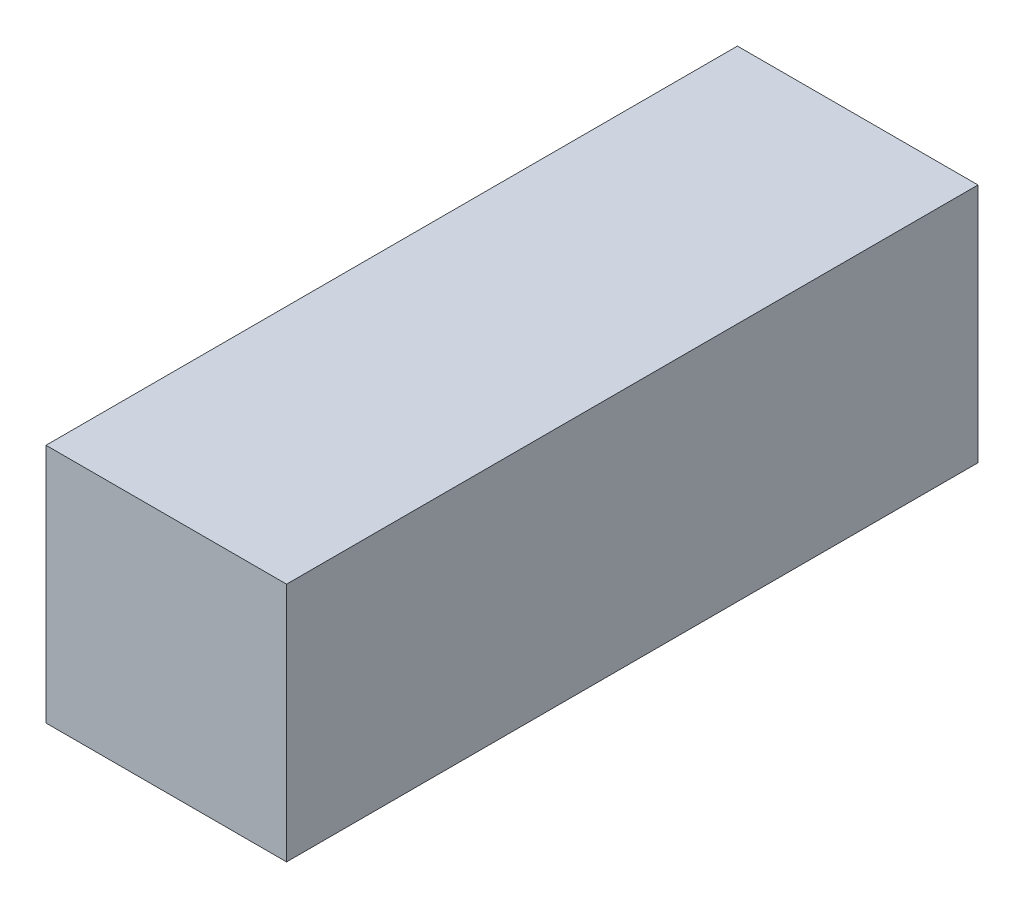
ISO-10303-21;
HEADER;
FILE_DESCRIPTION(('STEP AP214'),'2;1');
FILE_NAME('part.step','',(''),(''),'','','');
FILE_SCHEMA(('AUTOMOTIVE_DESIGN { 1 0 10303 214 1 1 1 1 }'));
ENDSEC;
DATA;
#1=APPLICATION_CONTEXT('core data for automotive mechanical design processes');
#2=APPLICATION_PROTOCOL_DEFINITION('international standard','automotive_design',2000,#1);
#3=PRODUCT_CONTEXT('',#1,'mechanical');
#4=PRODUCT('Part','Part','',(#3));
#5=PRODUCT_RELATED_PRODUCT_CATEGORY('part','',(#4));
#6=PRODUCT_DEFINITION_FORMATION('','',#4);
#7=PRODUCT_DEFINITION_CONTEXT('part definition',#1,'design');
#8=PRODUCT_DEFINITION('design','',#6,#7);
#9=PRODUCT_DEFINITION_SHAPE('','',#8);
#10=(LENGTH_UNIT() NAMED_UNIT(*) SI_UNIT(.MILLI.,.METRE.));
#11=(NAMED_UNIT(*) PLANE_ANGLE_UNIT() SI_UNIT($,.RADIAN.));
#12=(NAMED_UNIT(*) SI_UNIT($,.STERADIAN.) SOLID_ANGLE_UNIT());
#13=UNCERTAINTY_MEASURE_WITH_UNIT(LENGTH_MEASURE(1.E-05),#10,'distance_accuracy_value','');
#14=(GEOMETRIC_REPRESENTATION_CONTEXT(3) GLOBAL_UNCERTAINTY_ASSIGNED_CONTEXT((#13)) GLOBAL_UNIT_ASSIGNED_CONTEXT((#10,
#11,#12)) REPRESENTATION_CONTEXT('',''));
#15=CARTESIAN_POINT('',(0.,0.,0.));
#16=DIRECTION('',(0.,0.,1.));
#17=DIRECTION('',(1.,0.,0.));
#18=AXIS2_PLACEMENT_3D('',#15,#16,#17);
#19=CARTESIAN_POINT('',(3.175,-3.175,18.25));
#20=DIRECTION('',(-1.,0.,0.));
#21=DIRECTION('',(0.,0.,1.));
#22=AXIS2_PLACEMENT_3D('',#19,#20,#21);
#23=PLANE('',#22);
#24=DIRECTION('',(0.,1.,0.));
#25=VECTOR('',#24,1.);
#26=CARTESIAN_POINT('',(3.175,-3.175,0.));
#27=LINE('',#26,#25);
#28=CARTESIAN_POINT('',(3.175,-3.175,0.));
#29=VERTEX_POINT('',#28);
#30=CARTESIAN_POINT('',(3.175,3.175,0.));
#31=VERTEX_POINT('',#30);
#32=EDGE_CURVE('E96',#29,#31,#27,.T.);
#33=ORIENTED_EDGE('',*,*,#32,.T.);
#34=DIRECTION('',(0.,0.,-1.));
#35=VECTOR('',#34,1.);
#36=CARTESIAN_POINT('',(3.175,3.175,18.25));
#37=LINE('',#36,#35);
#38=CARTESIAN_POINT('',(3.175,3.175,18.25));
#39=VERTEX_POINT('',#38);
#40=EDGE_CURVE('E11',#39,#31,#37,.T.);
#41=ORIENTED_EDGE('',*,*,#40,.F.);
#42=DIRECTION('',(0.,1.,0.));
#43=VECTOR('',#42,1.);
#44=CARTESIAN_POINT('',(3.175,-3.175,18.25));
#45=LINE('',#44,#43);
#46=CARTESIAN_POINT('',(3.175,-3.175,18.25));
#47=VERTEX_POINT('',#46);
#48=EDGE_CURVE('E84',#47,#39,#45,.T.);
#49=ORIENTED_EDGE('',*,*,#48,.F.);
#50=DIRECTION('',(0.,0.,-1.));
#51=VECTOR('',#50,1.);
#52=CARTESIAN_POINT('',(3.175,-3.175,18.25));
#53=LINE('',#52,#51);
#54=EDGE_CURVE('E92',#47,#29,#53,.T.);
#55=ORIENTED_EDGE('',*,*,#54,.T.);
#56=EDGE_LOOP('',(#33,#41,#49,#55));
#57=FACE_BOUND('',#56,.T.);
#58=ADVANCED_FACE('F33',(#57),#23,.F.);
#59=CARTESIAN_POINT('',(-3.175,3.175,18.25));
#60=DIRECTION('',(0.,-1.,0.));
#61=DIRECTION('',(0.,0.,-1.));
#62=AXIS2_PLACEMENT_3D('',#59,#60,#61);
#63=PLANE('',#62);
#64=DIRECTION('',(-1.,0.,0.));
#65=VECTOR('',#64,1.);
#66=CARTESIAN_POINT('',(-3.175,3.175,0.));
#67=LINE('',#66,#65);
#68=CARTESIAN_POINT('',(-3.175,3.175,0.));
#69=VERTEX_POINT('',#68);
#70=EDGE_CURVE('E88',#31,#69,#67,.T.);
#71=ORIENTED_EDGE('',*,*,#70,.T.);
#72=DIRECTION('',(0.,0.,-1.));
#73=VECTOR('',#72,1.);
#74=CARTESIAN_POINT('',(-3.175,3.175,18.25));
#75=LINE('',#74,#73);
#76=CARTESIAN_POINT('',(-3.175,3.175,18.25));
#77=VERTEX_POINT('',#76);
#78=EDGE_CURVE('E41',#77,#69,#75,.T.);
#79=ORIENTED_EDGE('',*,*,#78,.F.);
#80=DIRECTION('',(-1.,0.,0.));
#81=VECTOR('',#80,1.);
#82=CARTESIAN_POINT('',(-3.175,3.175,18.25));
#83=LINE('',#82,#81);
#84=EDGE_CURVE('E79',#39,#77,#83,.T.);
#85=ORIENTED_EDGE('',*,*,#84,.F.);
#86=ORIENTED_EDGE('',*,*,#40,.T.);
#87=EDGE_LOOP('',(#71,#79,#85,#86));
#88=FACE_BOUND('',#87,.T.);
#89=ADVANCED_FACE('F87',(#88),#63,.F.);
#90=CARTESIAN_POINT('',(-3.175,-3.175,18.25));
#91=DIRECTION('',(1.,0.,0.));
#92=DIRECTION('',(0.,0.,-1.));
#93=AXIS2_PLACEMENT_3D('',#90,#91,#92);
#94=PLANE('',#93);
#95=DIRECTION('',(0.,-1.,0.));
#96=VECTOR('',#95,1.);
#97=CARTESIAN_POINT('',(-3.175,-3.175,0.));
#98=LINE('',#97,#96);
#99=CARTESIAN_POINT('',(-3.175,-3.175,0.));
#100=VERTEX_POINT('',#99);
#101=EDGE_CURVE('E66',#69,#100,#98,.T.);
#102=ORIENTED_EDGE('',*,*,#101,.T.);
#103=DIRECTION('',(0.,0.,-1.));
#104=VECTOR('',#103,1.);
#105=CARTESIAN_POINT('',(-3.175,-3.175,18.25));
#106=LINE('',#105,#104);
#107=CARTESIAN_POINT('',(-3.175,-3.175,18.25));
#108=VERTEX_POINT('',#107);
#109=EDGE_CURVE('E89',#108,#100,#106,.T.);
#110=ORIENTED_EDGE('',*,*,#109,.F.);
#111=DIRECTION('',(0.,-1.,0.));
#112=VECTOR('',#111,1.);
#113=CARTESIAN_POINT('',(-3.175,-3.175,18.25));
#114=LINE('',#113,#112);
#115=EDGE_CURVE('E82',#77,#108,#114,.T.);
#116=ORIENTED_EDGE('',*,*,#115,.F.);
#117=ORIENTED_EDGE('',*,*,#78,.T.);
#118=EDGE_LOOP('',(#102,#110,#116,#117));
#119=FACE_BOUND('',#118,.T.);
#120=ADVANCED_FACE('F90',(#119),#94,.F.);
#121=CARTESIAN_POINT('',(-3.175,-3.175,18.25));
#122=DIRECTION('',(0.,1.,0.));
#123=DIRECTION('',(0.,0.,1.));
#124=AXIS2_PLACEMENT_3D('',#121,#122,#123);
#125=PLANE('',#124);
#126=DIRECTION('',(1.,0.,0.));
#127=VECTOR('',#126,1.);
#128=CARTESIAN_POINT('',(-3.175,-3.175,0.));
#129=LINE('',#128,#127);
#130=EDGE_CURVE('E72',#100,#29,#129,.T.);
#131=ORIENTED_EDGE('',*,*,#130,.T.);
#132=ORIENTED_EDGE('',*,*,#54,.F.);
#133=DIRECTION('',(1.,0.,0.));
#134=VECTOR('',#133,1.);
#135=CARTESIAN_POINT('',(-3.175,-3.175,18.25));
#136=LINE('',#135,#134);
#137=EDGE_CURVE('E49',#108,#47,#136,.T.);
#138=ORIENTED_EDGE('',*,*,#137,.F.);
#139=ORIENTED_EDGE('',*,*,#109,.T.);
#140=EDGE_LOOP('',(#131,#132,#138,#139));
#141=FACE_BOUND('',#140,.T.);
#142=ADVANCED_FACE('F103',(#141),#125,.F.);
#143=CARTESIAN_POINT('',(3.175,3.175,18.25));
#144=DIRECTION('',(0.,0.,-1.));
#145=DIRECTION('',(-1.,0.,0.));
#146=AXIS2_PLACEMENT_3D('',#143,#144,#145);
#147=PLANE('',#146);
#148=ORIENTED_EDGE('',*,*,#48,.T.);
#149=ORIENTED_EDGE('',*,*,#84,.T.);
#150=ORIENTED_EDGE('',*,*,#115,.T.);
#151=ORIENTED_EDGE('',*,*,#137,.T.);
#152=EDGE_LOOP('',(#148,#149,#150,#151));
#153=FACE_BOUND('',#152,.T.);
#154=ADVANCED_FACE('F80',(#153),#147,.F.);
#155=CARTESIAN_POINT('',(3.175,3.175,0.));
#156=DIRECTION('',(0.,0.,-1.));
#157=DIRECTION('',(-1.,0.,0.));
#158=AXIS2_PLACEMENT_3D('',#155,#156,#157);
#159=PLANE('',#158);
#160=ORIENTED_EDGE('',*,*,#32,.F.);
#161=ORIENTED_EDGE('',*,*,#130,.F.);
#162=ORIENTED_EDGE('',*,*,#101,.F.);
#163=ORIENTED_EDGE('',*,*,#70,.F.);
#164=EDGE_LOOP('',(#160,#161,#162,#163));
#165=FACE_BOUND('',#164,.T.);
#166=ADVANCED_FACE('F106',(#165),#159,.T.);
#167=CLOSED_SHELL('',(#58,#89,#120,#142,#154,#166));
#168=MANIFOLD_SOLID_BREP('B2',#167);
#169=ADVANCED_BREP_SHAPE_REPRESENTATION('',(#18,#168),#14);
#170=SHAPE_DEFINITION_REPRESENTATION(#9,#169);
ENDSEC;
END-ISO-10303-21;
